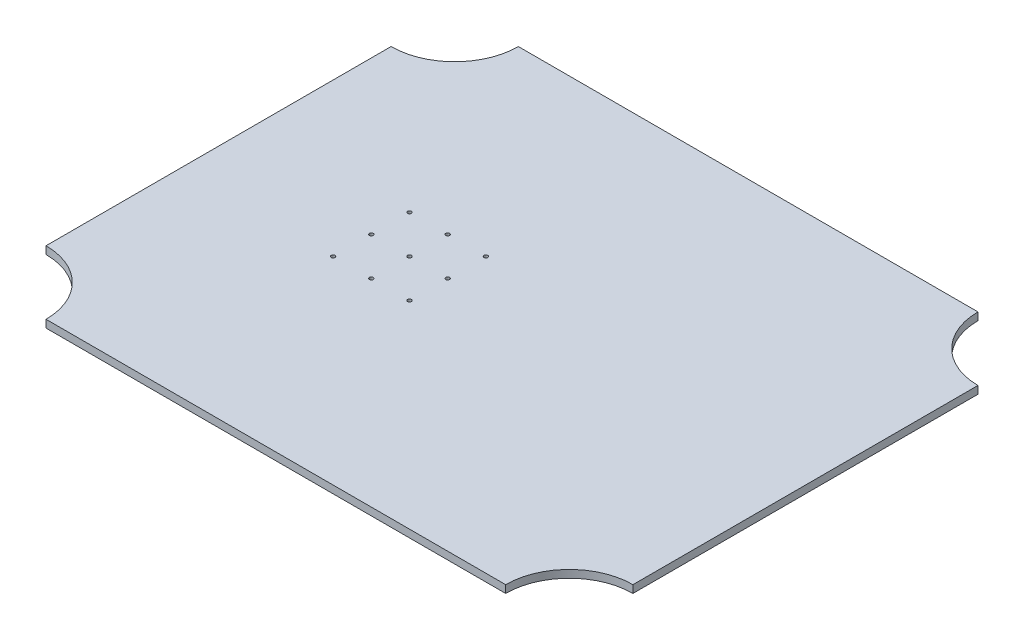
ISO-10303-21;
HEADER;
FILE_DESCRIPTION(('STEP AP214'),'2;1');
FILE_NAME('part.step','',(''),(''),'','','');
FILE_SCHEMA(('AUTOMOTIVE_DESIGN { 1 0 10303 214 1 1 1 1 }'));
ENDSEC;
DATA;
#1=APPLICATION_CONTEXT('core data for automotive mechanical design processes');
#2=APPLICATION_PROTOCOL_DEFINITION('international standard','automotive_design',2000,#1);
#3=PRODUCT_CONTEXT('',#1,'mechanical');
#4=PRODUCT('Part','Part','',(#3));
#5=PRODUCT_RELATED_PRODUCT_CATEGORY('part','',(#4));
#6=PRODUCT_DEFINITION_FORMATION('','',#4);
#7=PRODUCT_DEFINITION_CONTEXT('part definition',#1,'design');
#8=PRODUCT_DEFINITION('design','',#6,#7);
#9=PRODUCT_DEFINITION_SHAPE('','',#8);
#10=(LENGTH_UNIT() NAMED_UNIT(*) SI_UNIT(.MILLI.,.METRE.));
#11=(NAMED_UNIT(*) PLANE_ANGLE_UNIT() SI_UNIT($,.RADIAN.));
#12=(NAMED_UNIT(*) SI_UNIT($,.STERADIAN.) SOLID_ANGLE_UNIT());
#13=UNCERTAINTY_MEASURE_WITH_UNIT(LENGTH_MEASURE(1.E-05),#10,'distance_accuracy_value','');
#14=(GEOMETRIC_REPRESENTATION_CONTEXT(3) GLOBAL_UNCERTAINTY_ASSIGNED_CONTEXT((#13)) GLOBAL_UNIT_ASSIGNED_CONTEXT((#10,
#11,#12)) REPRESENTATION_CONTEXT('',''));
#15=CARTESIAN_POINT('',(0.,0.,0.));
#16=DIRECTION('',(0.,0.,1.));
#17=DIRECTION('',(1.,0.,0.));
#18=AXIS2_PLACEMENT_3D('',#15,#16,#17);
#19=CARTESIAN_POINT('',(1200.81279875035,6.,-185.5));
#20=DIRECTION('',(0.,1.,0.));
#21=DIRECTION('',(0.,0.,1.));
#22=AXIS2_PLACEMENT_3D('',#19,#20,#21);
#23=PLANE('',#22);
#24=CARTESIAN_POINT('',(1350.81279875035,6.,29.9999999999997));
#25=DIRECTION('',(0.,1.,0.));
#26=DIRECTION('',(0.,0.,-1.));
#27=AXIS2_PLACEMENT_3D('',#24,#25,#26);
#28=CIRCLE('',#27,1.50000000000008);
#29=CARTESIAN_POINT('',(1350.81279875035,6.,28.4999999999996));
#30=VERTEX_POINT('',#29);
#31=EDGE_CURVE('E224',#30,#30,#28,.T.);
#32=ORIENTED_EDGE('',*,*,#31,.F.);
#33=EDGE_LOOP('',(#32));
#34=FACE_BOUND('',#33,.T.);
#35=CARTESIAN_POINT('',(1350.81279875035,6.,-3.05311331771918E-13));
#36=DIRECTION('',(0.,1.,0.));
#37=DIRECTION('',(0.,0.,1.));
#38=AXIS2_PLACEMENT_3D('',#35,#36,#37);
#39=CIRCLE('',#38,1.50000000000008);
#40=CARTESIAN_POINT('',(1350.81279875035,6.,1.49999999999978));
#41=VERTEX_POINT('',#40);
#42=EDGE_CURVE('E212',#41,#41,#39,.T.);
#43=ORIENTED_EDGE('',*,*,#42,.F.);
#44=EDGE_LOOP('',(#43));
#45=FACE_BOUND('',#44,.T.);
#46=CARTESIAN_POINT('',(1350.81279875035,6.,-30.0000000000003));
#47=DIRECTION('',(0.,1.,0.));
#48=DIRECTION('',(0.,0.,1.));
#49=AXIS2_PLACEMENT_3D('',#46,#47,#48);
#50=CIRCLE('',#49,1.50000000000008);
#51=CARTESIAN_POINT('',(1350.81279875035,6.,-28.5000000000002));
#52=VERTEX_POINT('',#51);
#53=EDGE_CURVE('E200',#52,#52,#50,.T.);
#54=ORIENTED_EDGE('',*,*,#53,.F.);
#55=EDGE_LOOP('',(#54));
#56=FACE_BOUND('',#55,.T.);
#57=CARTESIAN_POINT('',(1320.81279875035,6.,-3.05311331771918E-13));
#58=DIRECTION('',(0.,1.,0.));
#59=DIRECTION('',(0.,0.,1.));
#60=AXIS2_PLACEMENT_3D('',#57,#58,#59);
#61=CIRCLE('',#60,1.50000000000008);
#62=CARTESIAN_POINT('',(1320.81279875035,6.,1.49999999999978));
#63=VERTEX_POINT('',#62);
#64=EDGE_CURVE('E188',#63,#63,#61,.T.);
#65=ORIENTED_EDGE('',*,*,#64,.F.);
#66=EDGE_LOOP('',(#65));
#67=FACE_BOUND('',#66,.T.);
#68=CARTESIAN_POINT('',(1200.81279875035,6.,-185.5));
#69=DIRECTION('',(0.,-1.,0.));
#70=DIRECTION('',(0.,0.,1.));
#71=AXIS2_PLACEMENT_3D('',#68,#69,#70);
#72=CIRCLE('',#71,50.);
#73=CARTESIAN_POINT('',(1250.81279875035,6.,-185.5));
#74=VERTEX_POINT('',#73);
#75=CARTESIAN_POINT('',(1200.81279875035,6.,-135.5));
#76=VERTEX_POINT('',#75);
#77=EDGE_CURVE('E151',#74,#76,#72,.T.);
#78=ORIENTED_EDGE('',*,*,#77,.T.);
#79=DIRECTION('',(0.,0.,1.));
#80=VECTOR('',#79,1.);
#81=CARTESIAN_POINT('',(1200.81279875035,6.,-135.5));
#82=LINE('',#81,#80);
#83=CARTESIAN_POINT('',(1200.81279875035,6.,135.5));
#84=VERTEX_POINT('',#83);
#85=EDGE_CURVE('E99',#76,#84,#82,.T.);
#86=ORIENTED_EDGE('',*,*,#85,.T.);
#87=CARTESIAN_POINT('',(1200.81279875035,6.,185.5));
#88=DIRECTION('',(0.,-1.,0.));
#89=DIRECTION('',(0.,0.,1.));
#90=AXIS2_PLACEMENT_3D('',#87,#88,#89);
#91=CIRCLE('',#90,50.);
#92=CARTESIAN_POINT('',(1250.81279875035,6.,185.5));
#93=VERTEX_POINT('',#92);
#94=EDGE_CURVE('E166',#84,#93,#91,.T.);
#95=ORIENTED_EDGE('',*,*,#94,.T.);
#96=DIRECTION('',(1.,0.,0.));
#97=VECTOR('',#96,1.);
#98=CARTESIAN_POINT('',(1250.81279875035,6.,185.5));
#99=LINE('',#98,#97);
#100=CARTESIAN_POINT('',(1611.81279875035,6.,185.5));
#101=VERTEX_POINT('',#100);
#102=EDGE_CURVE('E179',#93,#101,#99,.T.);
#103=ORIENTED_EDGE('',*,*,#102,.T.);
#104=CARTESIAN_POINT('',(1661.81279875035,6.,185.5));
#105=DIRECTION('',(0.,-1.,0.));
#106=DIRECTION('',(0.,0.,1.));
#107=AXIS2_PLACEMENT_3D('',#104,#105,#106);
#108=CIRCLE('',#107,50.);
#109=CARTESIAN_POINT('',(1661.81279875035,6.,135.5));
#110=VERTEX_POINT('',#109);
#111=EDGE_CURVE('E118',#101,#110,#108,.T.);
#112=ORIENTED_EDGE('',*,*,#111,.T.);
#113=DIRECTION('',(0.,0.,-1.));
#114=VECTOR('',#113,1.);
#115=CARTESIAN_POINT('',(1661.81279875035,6.,-135.5));
#116=LINE('',#115,#114);
#117=CARTESIAN_POINT('',(1661.81279875035,6.,-135.5));
#118=VERTEX_POINT('',#117);
#119=EDGE_CURVE('E112',#110,#118,#116,.T.);
#120=ORIENTED_EDGE('',*,*,#119,.T.);
#121=CARTESIAN_POINT('',(1661.81279875035,6.,-185.5));
#122=DIRECTION('',(0.,-1.,0.));
#123=DIRECTION('',(0.,0.,1.));
#124=AXIS2_PLACEMENT_3D('',#121,#122,#123);
#125=CIRCLE('',#124,50.);
#126=CARTESIAN_POINT('',(1611.81279875035,6.,-185.5));
#127=VERTEX_POINT('',#126);
#128=EDGE_CURVE('E116',#118,#127,#125,.T.);
#129=ORIENTED_EDGE('',*,*,#128,.T.);
#130=DIRECTION('',(-1.,0.,0.));
#131=VECTOR('',#130,1.);
#132=CARTESIAN_POINT('',(1250.81279875035,6.,-185.5));
#133=LINE('',#132,#131);
#134=EDGE_CURVE('E56',#127,#74,#133,.T.);
#135=ORIENTED_EDGE('',*,*,#134,.T.);
#136=EDGE_LOOP('',(#78,#86,#95,#103,#112,#120,#129,#135));
#137=FACE_BOUND('',#136,.T.);
#138=CARTESIAN_POINT('',(1380.81279875035,6.,29.9999999999997));
#139=DIRECTION('',(0.,1.,0.));
#140=DIRECTION('',(0.,0.,1.));
#141=AXIS2_PLACEMENT_3D('',#138,#139,#140);
#142=CIRCLE('',#141,1.50000000000008);
#143=CARTESIAN_POINT('',(1380.81279875035,6.,31.4999999999998));
#144=VERTEX_POINT('',#143);
#145=EDGE_CURVE('E140',#144,#144,#142,.T.);
#146=ORIENTED_EDGE('',*,*,#145,.F.);
#147=EDGE_LOOP('',(#146));
#148=FACE_BOUND('',#147,.T.);
#149=CARTESIAN_POINT('',(1320.81279875035,6.,-30.0000000000003));
#150=DIRECTION('',(0.,1.,0.));
#151=DIRECTION('',(0.,0.,1.));
#152=AXIS2_PLACEMENT_3D('',#149,#150,#151);
#153=CIRCLE('',#152,1.50000000000008);
#154=CARTESIAN_POINT('',(1320.81279875035,6.,-28.5000000000002));
#155=VERTEX_POINT('',#154);
#156=EDGE_CURVE('E194',#155,#155,#153,.T.);
#157=ORIENTED_EDGE('',*,*,#156,.F.);
#158=EDGE_LOOP('',(#157));
#159=FACE_BOUND('',#158,.T.);
#160=CARTESIAN_POINT('',(1380.81279875035,6.,-3.12659212566802E-13));
#161=DIRECTION('',(0.,1.,0.));
#162=DIRECTION('',(0.,0.,-1.));
#163=AXIS2_PLACEMENT_3D('',#160,#161,#162);
#164=CIRCLE('',#163,1.50000000000008);
#165=CARTESIAN_POINT('',(1380.81279875035,6.,-1.50000000000039));
#166=VERTEX_POINT('',#165);
#167=EDGE_CURVE('E206',#166,#166,#164,.T.);
#168=ORIENTED_EDGE('',*,*,#167,.F.);
#169=EDGE_LOOP('',(#168));
#170=FACE_BOUND('',#169,.T.);
#171=CARTESIAN_POINT('',(1380.81279875035,6.,-30.0000000000003));
#172=DIRECTION('',(0.,1.,0.));
#173=DIRECTION('',(0.,0.,-1.));
#174=AXIS2_PLACEMENT_3D('',#171,#172,#173);
#175=CIRCLE('',#174,1.50000000000008);
#176=CARTESIAN_POINT('',(1380.81279875035,6.,-31.5000000000004));
#177=VERTEX_POINT('',#176);
#178=EDGE_CURVE('E218',#177,#177,#175,.T.);
#179=ORIENTED_EDGE('',*,*,#178,.F.);
#180=EDGE_LOOP('',(#179));
#181=FACE_BOUND('',#180,.T.);
#182=CARTESIAN_POINT('',(1320.81279875035,6.,29.9999999999997));
#183=DIRECTION('',(0.,1.,0.));
#184=DIRECTION('',(0.,0.,-1.));
#185=AXIS2_PLACEMENT_3D('',#182,#183,#184);
#186=CIRCLE('',#185,1.50000000000008);
#187=CARTESIAN_POINT('',(1320.81279875035,6.,28.4999999999996));
#188=VERTEX_POINT('',#187);
#189=EDGE_CURVE('E230',#188,#188,#186,.T.);
#190=ORIENTED_EDGE('',*,*,#189,.F.);
#191=EDGE_LOOP('',(#190));
#192=FACE_BOUND('',#191,.T.);
#193=ADVANCED_FACE('F39',(#34,#45,#56,#67,#137,#148,#159,#170,#181,#192),#23,.T.);
#194=CARTESIAN_POINT('',(1200.81279875035,0.,-185.5));
#195=DIRECTION('',(0.,1.,0.));
#196=DIRECTION('',(0.,0.,1.));
#197=AXIS2_PLACEMENT_3D('',#194,#195,#196);
#198=PLANE('',#197);
#199=CARTESIAN_POINT('',(1200.81279875035,0.,-185.5));
#200=DIRECTION('',(0.,-1.,0.));
#201=DIRECTION('',(0.,0.,1.));
#202=AXIS2_PLACEMENT_3D('',#199,#200,#201);
#203=CIRCLE('',#202,50.);
#204=CARTESIAN_POINT('',(1250.81279875035,0.,-185.5));
#205=VERTEX_POINT('',#204);
#206=CARTESIAN_POINT('',(1200.81279875035,0.,-135.5));
#207=VERTEX_POINT('',#206);
#208=EDGE_CURVE('E136',#205,#207,#203,.T.);
#209=ORIENTED_EDGE('',*,*,#208,.F.);
#210=DIRECTION('',(-1.,0.,0.));
#211=VECTOR('',#210,1.);
#212=CARTESIAN_POINT('',(1250.81279875035,0.,-185.5));
#213=LINE('',#212,#211);
#214=CARTESIAN_POINT('',(1611.81279875035,0.,-185.5));
#215=VERTEX_POINT('',#214);
#216=EDGE_CURVE('E91',#215,#205,#213,.T.);
#217=ORIENTED_EDGE('',*,*,#216,.F.);
#218=CARTESIAN_POINT('',(1661.81279875035,0.,-185.5));
#219=DIRECTION('',(0.,-1.,0.));
#220=DIRECTION('',(0.,0.,1.));
#221=AXIS2_PLACEMENT_3D('',#218,#219,#220);
#222=CIRCLE('',#221,50.);
#223=CARTESIAN_POINT('',(1661.81279875035,0.,-135.5));
#224=VERTEX_POINT('',#223);
#225=EDGE_CURVE('E85',#224,#215,#222,.T.);
#226=ORIENTED_EDGE('',*,*,#225,.F.);
#227=DIRECTION('',(0.,0.,-1.));
#228=VECTOR('',#227,1.);
#229=CARTESIAN_POINT('',(1661.81279875035,0.,-135.5));
#230=LINE('',#229,#228);
#231=CARTESIAN_POINT('',(1661.81279875035,0.,135.5));
#232=VERTEX_POINT('',#231);
#233=EDGE_CURVE('E126',#232,#224,#230,.T.);
#234=ORIENTED_EDGE('',*,*,#233,.F.);
#235=CARTESIAN_POINT('',(1661.81279875035,0.,185.5));
#236=DIRECTION('',(0.,-1.,0.));
#237=DIRECTION('',(0.,0.,1.));
#238=AXIS2_PLACEMENT_3D('',#235,#236,#237);
#239=CIRCLE('',#238,50.);
#240=CARTESIAN_POINT('',(1611.81279875035,0.,185.5));
#241=VERTEX_POINT('',#240);
#242=EDGE_CURVE('E146',#241,#232,#239,.T.);
#243=ORIENTED_EDGE('',*,*,#242,.F.);
#244=DIRECTION('',(1.,0.,0.));
#245=VECTOR('',#244,1.);
#246=CARTESIAN_POINT('',(1250.81279875035,0.,185.5));
#247=LINE('',#246,#245);
#248=CARTESIAN_POINT('',(1250.81279875035,0.,185.5));
#249=VERTEX_POINT('',#248);
#250=EDGE_CURVE('E144',#249,#241,#247,.T.);
#251=ORIENTED_EDGE('',*,*,#250,.F.);
#252=CARTESIAN_POINT('',(1200.81279875035,0.,185.5));
#253=DIRECTION('',(0.,-1.,0.));
#254=DIRECTION('',(0.,0.,1.));
#255=AXIS2_PLACEMENT_3D('',#252,#253,#254);
#256=CIRCLE('',#255,50.);
#257=CARTESIAN_POINT('',(1200.81279875035,0.,135.5));
#258=VERTEX_POINT('',#257);
#259=EDGE_CURVE('E142',#258,#249,#256,.T.);
#260=ORIENTED_EDGE('',*,*,#259,.F.);
#261=DIRECTION('',(0.,0.,1.));
#262=VECTOR('',#261,1.);
#263=CARTESIAN_POINT('',(1200.81279875035,0.,-135.5));
#264=LINE('',#263,#262);
#265=EDGE_CURVE('E139',#207,#258,#264,.T.);
#266=ORIENTED_EDGE('',*,*,#265,.F.);
#267=EDGE_LOOP('',(#209,#217,#226,#234,#243,#251,#260,#266));
#268=FACE_BOUND('',#267,.T.);
#269=CARTESIAN_POINT('',(1380.81279875035,0.,29.9999999999997));
#270=DIRECTION('',(0.,1.,0.));
#271=DIRECTION('',(0.,0.,1.));
#272=AXIS2_PLACEMENT_3D('',#269,#270,#271);
#273=CIRCLE('',#272,1.50000000000008);
#274=CARTESIAN_POINT('',(1380.81279875035,0.,31.4999999999998));
#275=VERTEX_POINT('',#274);
#276=EDGE_CURVE('E185',#275,#275,#273,.T.);
#277=ORIENTED_EDGE('',*,*,#276,.T.);
#278=EDGE_LOOP('',(#277));
#279=FACE_BOUND('',#278,.T.);
#280=CARTESIAN_POINT('',(1320.81279875035,0.,-3.05311331771918E-13));
#281=DIRECTION('',(0.,1.,0.));
#282=DIRECTION('',(0.,0.,1.));
#283=AXIS2_PLACEMENT_3D('',#280,#281,#282);
#284=CIRCLE('',#283,1.50000000000008);
#285=CARTESIAN_POINT('',(1320.81279875035,0.,1.49999999999978));
#286=VERTEX_POINT('',#285);
#287=EDGE_CURVE('E191',#286,#286,#284,.T.);
#288=ORIENTED_EDGE('',*,*,#287,.T.);
#289=EDGE_LOOP('',(#288));
#290=FACE_BOUND('',#289,.T.);
#291=CARTESIAN_POINT('',(1320.81279875035,0.,-30.0000000000003));
#292=DIRECTION('',(0.,1.,0.));
#293=DIRECTION('',(0.,0.,1.));
#294=AXIS2_PLACEMENT_3D('',#291,#292,#293);
#295=CIRCLE('',#294,1.50000000000008);
#296=CARTESIAN_POINT('',(1320.81279875035,0.,-28.5000000000002));
#297=VERTEX_POINT('',#296);
#298=EDGE_CURVE('E197',#297,#297,#295,.T.);
#299=ORIENTED_EDGE('',*,*,#298,.T.);
#300=EDGE_LOOP('',(#299));
#301=FACE_BOUND('',#300,.T.);
#302=CARTESIAN_POINT('',(1350.81279875035,0.,-30.0000000000003));
#303=DIRECTION('',(0.,1.,0.));
#304=DIRECTION('',(0.,0.,1.));
#305=AXIS2_PLACEMENT_3D('',#302,#303,#304);
#306=CIRCLE('',#305,1.50000000000008);
#307=CARTESIAN_POINT('',(1350.81279875035,0.,-28.5000000000002));
#308=VERTEX_POINT('',#307);
#309=EDGE_CURVE('E203',#308,#308,#306,.T.);
#310=ORIENTED_EDGE('',*,*,#309,.T.);
#311=EDGE_LOOP('',(#310));
#312=FACE_BOUND('',#311,.T.);
#313=CARTESIAN_POINT('',(1380.81279875035,0.,-3.12659212566802E-13));
#314=DIRECTION('',(0.,1.,0.));
#315=DIRECTION('',(0.,0.,-1.));
#316=AXIS2_PLACEMENT_3D('',#313,#314,#315);
#317=CIRCLE('',#316,1.50000000000008);
#318=CARTESIAN_POINT('',(1380.81279875035,0.,-1.50000000000039));
#319=VERTEX_POINT('',#318);
#320=EDGE_CURVE('E209',#319,#319,#317,.T.);
#321=ORIENTED_EDGE('',*,*,#320,.T.);
#322=EDGE_LOOP('',(#321));
#323=FACE_BOUND('',#322,.T.);
#324=CARTESIAN_POINT('',(1350.81279875035,0.,-3.05311331771918E-13));
#325=DIRECTION('',(0.,1.,0.));
#326=DIRECTION('',(0.,0.,1.));
#327=AXIS2_PLACEMENT_3D('',#324,#325,#326);
#328=CIRCLE('',#327,1.50000000000008);
#329=CARTESIAN_POINT('',(1350.81279875035,0.,1.49999999999978));
#330=VERTEX_POINT('',#329);
#331=EDGE_CURVE('E215',#330,#330,#328,.T.);
#332=ORIENTED_EDGE('',*,*,#331,.T.);
#333=EDGE_LOOP('',(#332));
#334=FACE_BOUND('',#333,.T.);
#335=CARTESIAN_POINT('',(1380.81279875035,0.,-30.0000000000003));
#336=DIRECTION('',(0.,1.,0.));
#337=DIRECTION('',(0.,0.,-1.));
#338=AXIS2_PLACEMENT_3D('',#335,#336,#337);
#339=CIRCLE('',#338,1.50000000000008);
#340=CARTESIAN_POINT('',(1380.81279875035,0.,-31.5000000000004));
#341=VERTEX_POINT('',#340);
#342=EDGE_CURVE('E221',#341,#341,#339,.T.);
#343=ORIENTED_EDGE('',*,*,#342,.T.);
#344=EDGE_LOOP('',(#343));
#345=FACE_BOUND('',#344,.T.);
#346=CARTESIAN_POINT('',(1350.81279875035,0.,29.9999999999997));
#347=DIRECTION('',(0.,1.,0.));
#348=DIRECTION('',(0.,0.,-1.));
#349=AXIS2_PLACEMENT_3D('',#346,#347,#348);
#350=CIRCLE('',#349,1.50000000000008);
#351=CARTESIAN_POINT('',(1350.81279875035,0.,28.4999999999996));
#352=VERTEX_POINT('',#351);
#353=EDGE_CURVE('E227',#352,#352,#350,.T.);
#354=ORIENTED_EDGE('',*,*,#353,.T.);
#355=EDGE_LOOP('',(#354));
#356=FACE_BOUND('',#355,.T.);
#357=CARTESIAN_POINT('',(1320.81279875035,0.,29.9999999999997));
#358=DIRECTION('',(0.,1.,0.));
#359=DIRECTION('',(0.,0.,-1.));
#360=AXIS2_PLACEMENT_3D('',#357,#358,#359);
#361=CIRCLE('',#360,1.50000000000008);
#362=CARTESIAN_POINT('',(1320.81279875035,0.,28.4999999999996));
#363=VERTEX_POINT('',#362);
#364=EDGE_CURVE('E233',#363,#363,#361,.T.);
#365=ORIENTED_EDGE('',*,*,#364,.T.);
#366=EDGE_LOOP('',(#365));
#367=FACE_BOUND('',#366,.T.);
#368=ADVANCED_FACE('F170',(#268,#279,#290,#301,#312,#323,#334,#345,#356,#367),#198,.F.);
#369=CARTESIAN_POINT('',(1200.81279875035,6.,-185.5));
#370=DIRECTION('',(0.,-1.,0.));
#371=DIRECTION('',(0.,0.,-1.));
#372=AXIS2_PLACEMENT_3D('',#369,#370,#371);
#373=CYLINDRICAL_SURFACE('',#372,50.);
#374=ORIENTED_EDGE('',*,*,#208,.T.);
#375=DIRECTION('',(0.,-1.,0.));
#376=VECTOR('',#375,1.);
#377=CARTESIAN_POINT('',(1200.81279875035,6.,-135.5));
#378=LINE('',#377,#376);
#379=EDGE_CURVE('E11',#76,#207,#378,.T.);
#380=ORIENTED_EDGE('',*,*,#379,.F.);
#381=ORIENTED_EDGE('',*,*,#77,.F.);
#382=DIRECTION('',(0.,-1.,0.));
#383=VECTOR('',#382,1.);
#384=CARTESIAN_POINT('',(1250.81279875035,6.,-185.5));
#385=LINE('',#384,#383);
#386=EDGE_CURVE('E132',#74,#205,#385,.T.);
#387=ORIENTED_EDGE('',*,*,#386,.T.);
#388=EDGE_LOOP('',(#374,#380,#381,#387));
#389=FACE_BOUND('',#388,.T.);
#390=ADVANCED_FACE('F41',(#389),#373,.F.);
#391=CARTESIAN_POINT('',(1200.81279875035,6.,-135.5));
#392=DIRECTION('',(1.,0.,0.));
#393=DIRECTION('',(0.,0.,-1.));
#394=AXIS2_PLACEMENT_3D('',#391,#392,#393);
#395=PLANE('',#394);
#396=ORIENTED_EDGE('',*,*,#265,.T.);
#397=DIRECTION('',(0.,-1.,0.));
#398=VECTOR('',#397,1.);
#399=CARTESIAN_POINT('',(1200.81279875035,6.,135.5));
#400=LINE('',#399,#398);
#401=EDGE_CURVE('E48',#84,#258,#400,.T.);
#402=ORIENTED_EDGE('',*,*,#401,.F.);
#403=ORIENTED_EDGE('',*,*,#85,.F.);
#404=ORIENTED_EDGE('',*,*,#379,.T.);
#405=EDGE_LOOP('',(#396,#402,#403,#404));
#406=FACE_BOUND('',#405,.T.);
#407=ADVANCED_FACE('F267',(#406),#395,.F.);
#408=CARTESIAN_POINT('',(1200.81279875035,6.,185.5));
#409=DIRECTION('',(0.,-1.,0.));
#410=DIRECTION('',(0.,0.,-1.));
#411=AXIS2_PLACEMENT_3D('',#408,#409,#410);
#412=CYLINDRICAL_SURFACE('',#411,50.);
#413=ORIENTED_EDGE('',*,*,#259,.T.);
#414=DIRECTION('',(0.,-1.,0.));
#415=VECTOR('',#414,1.);
#416=CARTESIAN_POINT('',(1250.81279875035,6.,185.5));
#417=LINE('',#416,#415);
#418=EDGE_CURVE('E158',#93,#249,#417,.T.);
#419=ORIENTED_EDGE('',*,*,#418,.F.);
#420=ORIENTED_EDGE('',*,*,#94,.F.);
#421=ORIENTED_EDGE('',*,*,#401,.T.);
#422=EDGE_LOOP('',(#413,#419,#420,#421));
#423=FACE_BOUND('',#422,.T.);
#424=ADVANCED_FACE('F164',(#423),#412,.F.);
#425=CARTESIAN_POINT('',(1250.81279875035,6.,185.5));
#426=DIRECTION('',(0.,0.,-1.));
#427=DIRECTION('',(-1.,0.,0.));
#428=AXIS2_PLACEMENT_3D('',#425,#426,#427);
#429=PLANE('',#428);
#430=ORIENTED_EDGE('',*,*,#250,.T.);
#431=DIRECTION('',(0.,-1.,0.));
#432=VECTOR('',#431,1.);
#433=CARTESIAN_POINT('',(1611.81279875035,6.,185.5));
#434=LINE('',#433,#432);
#435=EDGE_CURVE('E155',#101,#241,#434,.T.);
#436=ORIENTED_EDGE('',*,*,#435,.F.);
#437=ORIENTED_EDGE('',*,*,#102,.F.);
#438=ORIENTED_EDGE('',*,*,#418,.T.);
#439=EDGE_LOOP('',(#430,#436,#437,#438));
#440=FACE_BOUND('',#439,.T.);
#441=ADVANCED_FACE('F175',(#440),#429,.F.);
#442=CARTESIAN_POINT('',(1661.81279875035,6.,185.5));
#443=DIRECTION('',(0.,-1.,0.));
#444=DIRECTION('',(0.,0.,-1.));
#445=AXIS2_PLACEMENT_3D('',#442,#443,#444);
#446=CYLINDRICAL_SURFACE('',#445,50.);
#447=ORIENTED_EDGE('',*,*,#242,.T.);
#448=DIRECTION('',(0.,-1.,0.));
#449=VECTOR('',#448,1.);
#450=CARTESIAN_POINT('',(1661.81279875035,6.,135.5));
#451=LINE('',#450,#449);
#452=EDGE_CURVE('E127',#110,#232,#451,.T.);
#453=ORIENTED_EDGE('',*,*,#452,.F.);
#454=ORIENTED_EDGE('',*,*,#111,.F.);
#455=ORIENTED_EDGE('',*,*,#435,.T.);
#456=EDGE_LOOP('',(#447,#453,#454,#455));
#457=FACE_BOUND('',#456,.T.);
#458=ADVANCED_FACE('F178',(#457),#446,.F.);
#459=CARTESIAN_POINT('',(1661.81279875035,6.,-135.5));
#460=DIRECTION('',(-1.,0.,0.));
#461=DIRECTION('',(0.,0.,1.));
#462=AXIS2_PLACEMENT_3D('',#459,#460,#461);
#463=PLANE('',#462);
#464=ORIENTED_EDGE('',*,*,#233,.T.);
#465=DIRECTION('',(0.,-1.,0.));
#466=VECTOR('',#465,1.);
#467=CARTESIAN_POINT('',(1661.81279875035,6.,-135.5));
#468=LINE('',#467,#466);
#469=EDGE_CURVE('E123',#118,#224,#468,.T.);
#470=ORIENTED_EDGE('',*,*,#469,.F.);
#471=ORIENTED_EDGE('',*,*,#119,.F.);
#472=ORIENTED_EDGE('',*,*,#452,.T.);
#473=EDGE_LOOP('',(#464,#470,#471,#472));
#474=FACE_BOUND('',#473,.T.);
#475=ADVANCED_FACE('F124',(#474),#463,.F.);
#476=CARTESIAN_POINT('',(1661.81279875035,6.,-185.5));
#477=DIRECTION('',(0.,-1.,0.));
#478=DIRECTION('',(0.,0.,-1.));
#479=AXIS2_PLACEMENT_3D('',#476,#477,#478);
#480=CYLINDRICAL_SURFACE('',#479,50.);
#481=ORIENTED_EDGE('',*,*,#225,.T.);
#482=DIRECTION('',(0.,-1.,0.));
#483=VECTOR('',#482,1.);
#484=CARTESIAN_POINT('',(1611.81279875035,6.,-185.5));
#485=LINE('',#484,#483);
#486=EDGE_CURVE('E128',#127,#215,#485,.T.);
#487=ORIENTED_EDGE('',*,*,#486,.F.);
#488=ORIENTED_EDGE('',*,*,#128,.F.);
#489=ORIENTED_EDGE('',*,*,#469,.T.);
#490=EDGE_LOOP('',(#481,#487,#488,#489));
#491=FACE_BOUND('',#490,.T.);
#492=ADVANCED_FACE('F130',(#491),#480,.F.);
#493=CARTESIAN_POINT('',(1250.81279875035,6.,-185.5));
#494=DIRECTION('',(0.,0.,1.));
#495=DIRECTION('',(1.,0.,0.));
#496=AXIS2_PLACEMENT_3D('',#493,#494,#495);
#497=PLANE('',#496);
#498=ORIENTED_EDGE('',*,*,#216,.T.);
#499=ORIENTED_EDGE('',*,*,#386,.F.);
#500=ORIENTED_EDGE('',*,*,#134,.F.);
#501=ORIENTED_EDGE('',*,*,#486,.T.);
#502=EDGE_LOOP('',(#498,#499,#500,#501));
#503=FACE_BOUND('',#502,.T.);
#504=ADVANCED_FACE('F255',(#503),#497,.F.);
#505=CARTESIAN_POINT('',(1380.81279875035,6.,29.9999999999997));
#506=DIRECTION('',(0.,-1.,0.));
#507=DIRECTION('',(0.,0.,-1.));
#508=AXIS2_PLACEMENT_3D('',#505,#506,#507);
#509=CYLINDRICAL_SURFACE('',#508,1.50000000000008);
#510=ORIENTED_EDGE('',*,*,#145,.T.);
#511=EDGE_LOOP('',(#510));
#512=FACE_BOUND('',#511,.T.);
#513=ORIENTED_EDGE('',*,*,#276,.F.);
#514=EDGE_LOOP('',(#513));
#515=FACE_BOUND('',#514,.T.);
#516=ADVANCED_FACE('F252',(#512,#515),#509,.F.);
#517=CARTESIAN_POINT('',(1320.81279875035,6.,-3.05311331771918E-13));
#518=DIRECTION('',(0.,-1.,0.));
#519=DIRECTION('',(0.,0.,-1.));
#520=AXIS2_PLACEMENT_3D('',#517,#518,#519);
#521=CYLINDRICAL_SURFACE('',#520,1.50000000000008);
#522=ORIENTED_EDGE('',*,*,#64,.T.);
#523=EDGE_LOOP('',(#522));
#524=FACE_BOUND('',#523,.T.);
#525=ORIENTED_EDGE('',*,*,#287,.F.);
#526=EDGE_LOOP('',(#525));
#527=FACE_BOUND('',#526,.T.);
#528=ADVANCED_FACE('F343',(#524,#527),#521,.F.);
#529=CARTESIAN_POINT('',(1320.81279875035,6.,-30.0000000000003));
#530=DIRECTION('',(0.,-1.,0.));
#531=DIRECTION('',(0.,0.,-1.));
#532=AXIS2_PLACEMENT_3D('',#529,#530,#531);
#533=CYLINDRICAL_SURFACE('',#532,1.50000000000008);
#534=ORIENTED_EDGE('',*,*,#156,.T.);
#535=EDGE_LOOP('',(#534));
#536=FACE_BOUND('',#535,.T.);
#537=ORIENTED_EDGE('',*,*,#298,.F.);
#538=EDGE_LOOP('',(#537));
#539=FACE_BOUND('',#538,.T.);
#540=ADVANCED_FACE('F352',(#536,#539),#533,.F.);
#541=CARTESIAN_POINT('',(1350.81279875035,6.,-30.0000000000003));
#542=DIRECTION('',(0.,-1.,0.));
#543=DIRECTION('',(0.,0.,-1.));
#544=AXIS2_PLACEMENT_3D('',#541,#542,#543);
#545=CYLINDRICAL_SURFACE('',#544,1.50000000000008);
#546=ORIENTED_EDGE('',*,*,#53,.T.);
#547=EDGE_LOOP('',(#546));
#548=FACE_BOUND('',#547,.T.);
#549=ORIENTED_EDGE('',*,*,#309,.F.);
#550=EDGE_LOOP('',(#549));
#551=FACE_BOUND('',#550,.T.);
#552=ADVANCED_FACE('F361',(#548,#551),#545,.F.);
#553=CARTESIAN_POINT('',(1380.81279875035,6.,-3.12659212566802E-13));
#554=DIRECTION('',(0.,-1.,0.));
#555=DIRECTION('',(0.,0.,-1.));
#556=AXIS2_PLACEMENT_3D('',#553,#554,#555);
#557=CYLINDRICAL_SURFACE('',#556,1.50000000000008);
#558=ORIENTED_EDGE('',*,*,#167,.T.);
#559=EDGE_LOOP('',(#558));
#560=FACE_BOUND('',#559,.T.);
#561=ORIENTED_EDGE('',*,*,#320,.F.);
#562=EDGE_LOOP('',(#561));
#563=FACE_BOUND('',#562,.T.);
#564=ADVANCED_FACE('F371',(#560,#563),#557,.F.);
#565=CARTESIAN_POINT('',(1350.81279875035,6.,-3.05311331771918E-13));
#566=DIRECTION('',(0.,-1.,0.));
#567=DIRECTION('',(0.,0.,-1.));
#568=AXIS2_PLACEMENT_3D('',#565,#566,#567);
#569=CYLINDRICAL_SURFACE('',#568,1.50000000000008);
#570=ORIENTED_EDGE('',*,*,#42,.T.);
#571=EDGE_LOOP('',(#570));
#572=FACE_BOUND('',#571,.T.);
#573=ORIENTED_EDGE('',*,*,#331,.F.);
#574=EDGE_LOOP('',(#573));
#575=FACE_BOUND('',#574,.T.);
#576=ADVANCED_FACE('F381',(#572,#575),#569,.F.);
#577=CARTESIAN_POINT('',(1380.81279875035,6.,-30.0000000000003));
#578=DIRECTION('',(0.,-1.,0.));
#579=DIRECTION('',(0.,0.,-1.));
#580=AXIS2_PLACEMENT_3D('',#577,#578,#579);
#581=CYLINDRICAL_SURFACE('',#580,1.50000000000008);
#582=ORIENTED_EDGE('',*,*,#178,.T.);
#583=EDGE_LOOP('',(#582));
#584=FACE_BOUND('',#583,.T.);
#585=ORIENTED_EDGE('',*,*,#342,.F.);
#586=EDGE_LOOP('',(#585));
#587=FACE_BOUND('',#586,.T.);
#588=ADVANCED_FACE('F391',(#584,#587),#581,.F.);
#589=CARTESIAN_POINT('',(1350.81279875035,6.,29.9999999999997));
#590=DIRECTION('',(0.,-1.,0.));
#591=DIRECTION('',(0.,0.,-1.));
#592=AXIS2_PLACEMENT_3D('',#589,#590,#591);
#593=CYLINDRICAL_SURFACE('',#592,1.50000000000008);
#594=ORIENTED_EDGE('',*,*,#31,.T.);
#595=EDGE_LOOP('',(#594));
#596=FACE_BOUND('',#595,.T.);
#597=ORIENTED_EDGE('',*,*,#353,.F.);
#598=EDGE_LOOP('',(#597));
#599=FACE_BOUND('',#598,.T.);
#600=ADVANCED_FACE('F401',(#596,#599),#593,.F.);
#601=CARTESIAN_POINT('',(1320.81279875035,6.,29.9999999999997));
#602=DIRECTION('',(0.,-1.,0.));
#603=DIRECTION('',(0.,0.,-1.));
#604=AXIS2_PLACEMENT_3D('',#601,#602,#603);
#605=CYLINDRICAL_SURFACE('',#604,1.50000000000008);
#606=ORIENTED_EDGE('',*,*,#189,.T.);
#607=EDGE_LOOP('',(#606));
#608=FACE_BOUND('',#607,.T.);
#609=ORIENTED_EDGE('',*,*,#364,.F.);
#610=EDGE_LOOP('',(#609));
#611=FACE_BOUND('',#610,.T.);
#612=ADVANCED_FACE('F239',(#608,#611),#605,.F.);
#613=CLOSED_SHELL('',(#193,#368,#390,#407,#424,#441,#458,#475,#492,#504,#516,#528,#540,#552,
#564,#576,#588,#600,#612));
#614=MANIFOLD_SOLID_BREP('B2',#613);
#615=ADVANCED_BREP_SHAPE_REPRESENTATION('',(#18,#614),#14);
#616=SHAPE_DEFINITION_REPRESENTATION(#9,#615);
ENDSEC;
END-ISO-10303-21;
